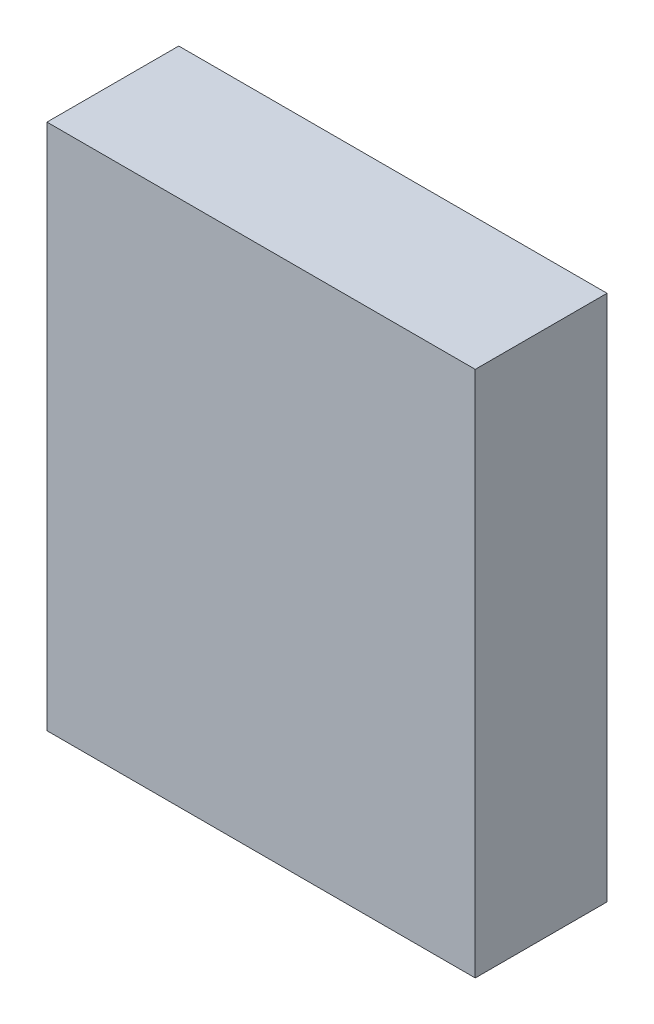
ISO-10303-21;
HEADER;
FILE_DESCRIPTION(('STEP AP214'),'2;1');
FILE_NAME('part.step','',(''),(''),'','','');
FILE_SCHEMA(('AUTOMOTIVE_DESIGN { 1 0 10303 214 1 1 1 1 }'));
ENDSEC;
DATA;
#1=APPLICATION_CONTEXT('core data for automotive mechanical design processes');
#2=APPLICATION_PROTOCOL_DEFINITION('international standard','automotive_design',2000,#1);
#3=PRODUCT_CONTEXT('',#1,'mechanical');
#4=PRODUCT('Part','Part','',(#3));
#5=PRODUCT_RELATED_PRODUCT_CATEGORY('part','',(#4));
#6=PRODUCT_DEFINITION_FORMATION('','',#4);
#7=PRODUCT_DEFINITION_CONTEXT('part definition',#1,'design');
#8=PRODUCT_DEFINITION('design','',#6,#7);
#9=PRODUCT_DEFINITION_SHAPE('','',#8);
#10=(LENGTH_UNIT() NAMED_UNIT(*) SI_UNIT(.MILLI.,.METRE.));
#11=(NAMED_UNIT(*) PLANE_ANGLE_UNIT() SI_UNIT($,.RADIAN.));
#12=(NAMED_UNIT(*) SI_UNIT($,.STERADIAN.) SOLID_ANGLE_UNIT());
#13=UNCERTAINTY_MEASURE_WITH_UNIT(LENGTH_MEASURE(1.E-05),#10,'distance_accuracy_value','');
#14=(GEOMETRIC_REPRESENTATION_CONTEXT(3) GLOBAL_UNCERTAINTY_ASSIGNED_CONTEXT((#13)) GLOBAL_UNIT_ASSIGNED_CONTEXT((#10,
#11,#12)) REPRESENTATION_CONTEXT('',''));
#15=CARTESIAN_POINT('',(0.,0.,0.));
#16=DIRECTION('',(0.,0.,1.));
#17=DIRECTION('',(1.,0.,0.));
#18=AXIS2_PLACEMENT_3D('',#15,#16,#17);
#19=CARTESIAN_POINT('',(-283.328848216629,276.320789782176,20.));
#20=DIRECTION('',(1.,0.,0.));
#21=DIRECTION('',(0.,0.,-1.));
#22=AXIS2_PLACEMENT_3D('',#19,#20,#21);
#23=PLANE('',#22);
#24=DIRECTION('',(0.,-1.,0.));
#25=VECTOR('',#24,1.);
#26=CARTESIAN_POINT('',(-283.328848216629,276.320789782176,0.));
#27=LINE('',#26,#25);
#28=CARTESIAN_POINT('',(-283.328848216629,356.320789782176,0.));
#29=VERTEX_POINT('',#28);
#30=CARTESIAN_POINT('',(-283.328848216629,276.320789782176,0.));
#31=VERTEX_POINT('',#30);
#32=EDGE_CURVE('E196',#29,#31,#27,.T.);
#33=ORIENTED_EDGE('',*,*,#32,.T.);
#34=DIRECTION('',(0.,0.,-1.));
#35=VECTOR('',#34,1.);
#36=CARTESIAN_POINT('',(-283.328848216629,276.320789782176,20.));
#37=LINE('',#36,#35);
#38=CARTESIAN_POINT('',(-283.328848216629,276.320789782176,20.));
#39=VERTEX_POINT('',#38);
#40=EDGE_CURVE('E244',#39,#31,#37,.T.);
#41=ORIENTED_EDGE('',*,*,#40,.F.);
#42=DIRECTION('',(0.,-1.,0.));
#43=VECTOR('',#42,1.);
#44=CARTESIAN_POINT('',(-283.328848216629,276.320789782176,20.));
#45=LINE('',#44,#43);
#46=CARTESIAN_POINT('',(-283.328848216629,356.320789782176,20.));
#47=VERTEX_POINT('',#46);
#48=EDGE_CURVE('E206',#47,#39,#45,.T.);
#49=ORIENTED_EDGE('',*,*,#48,.F.);
#50=DIRECTION('',(0.,0.,-1.));
#51=VECTOR('',#50,1.);
#52=CARTESIAN_POINT('',(-283.328848216629,356.320789782176,20.));
#53=LINE('',#52,#51);
#54=EDGE_CURVE('E220',#47,#29,#53,.T.);
#55=ORIENTED_EDGE('',*,*,#54,.T.);
#56=EDGE_LOOP('',(#33,#41,#49,#55));
#57=FACE_BOUND('',#56,.T.);
#58=ADVANCED_FACE('F39',(#57),#23,.F.);
#59=CARTESIAN_POINT('',(-218.328848216629,276.320789782176,20.));
#60=DIRECTION('',(0.,1.,0.));
#61=DIRECTION('',(0.,0.,1.));
#62=AXIS2_PLACEMENT_3D('',#59,#60,#61);
#63=PLANE('',#62);
#64=DIRECTION('',(1.,0.,0.));
#65=VECTOR('',#64,1.);
#66=CARTESIAN_POINT('',(-218.328848216629,276.320789782176,0.));
#67=LINE('',#66,#65);
#68=CARTESIAN_POINT('',(-260.330379364183,276.320789782176,0.));
#69=VERTEX_POINT('',#68);
#70=EDGE_CURVE('E225',#31,#69,#67,.T.);
#71=ORIENTED_EDGE('',*,*,#70,.T.);
#72=DIRECTION('',(0.,0.,-1.));
#73=VECTOR('',#72,1.);
#74=CARTESIAN_POINT('',(-260.330379364183,276.320789782176,7.6549872361529));
#75=LINE('',#74,#73);
#76=CARTESIAN_POINT('',(-260.330379364183,276.320789782176,7.6549872361529));
#77=VERTEX_POINT('',#76);
#78=EDGE_CURVE('E146',#77,#69,#75,.T.);
#79=ORIENTED_EDGE('',*,*,#78,.F.);
#80=DIRECTION('',(-1.,0.,0.));
#81=VECTOR('',#80,1.);
#82=CARTESIAN_POINT('',(-249.330379364183,276.320789782176,7.6549872361529));
#83=LINE('',#82,#81);
#84=CARTESIAN_POINT('',(-249.330379364183,276.320789782176,7.6549872361529));
#85=VERTEX_POINT('',#84);
#86=EDGE_CURVE('E130',#85,#77,#83,.T.);
#87=ORIENTED_EDGE('',*,*,#86,.F.);
#88=DIRECTION('',(0.,0.,1.));
#89=VECTOR('',#88,1.);
#90=CARTESIAN_POINT('',(-249.330379364183,276.320789782176,-0.845012763847098));
#91=LINE('',#90,#89);
#92=CARTESIAN_POINT('',(-249.330379364183,276.320789782176,0.));
#93=VERTEX_POINT('',#92);
#94=EDGE_CURVE('E139',#93,#85,#91,.T.);
#95=ORIENTED_EDGE('',*,*,#94,.F.);
#96=CARTESIAN_POINT('',(-218.328848216629,276.320789782176,0.));
#97=VERTEX_POINT('',#96);
#98=EDGE_CURVE('E224',#93,#97,#67,.T.);
#99=ORIENTED_EDGE('',*,*,#98,.T.);
#100=DIRECTION('',(0.,0.,-1.));
#101=VECTOR('',#100,1.);
#102=CARTESIAN_POINT('',(-218.328848216629,276.320789782176,20.));
#103=LINE('',#102,#101);
#104=CARTESIAN_POINT('',(-218.328848216629,276.320789782176,20.));
#105=VERTEX_POINT('',#104);
#106=EDGE_CURVE('E240',#105,#97,#103,.T.);
#107=ORIENTED_EDGE('',*,*,#106,.F.);
#108=DIRECTION('',(1.,0.,0.));
#109=VECTOR('',#108,1.);
#110=CARTESIAN_POINT('',(-218.328848216629,276.320789782176,20.));
#111=LINE('',#110,#109);
#112=EDGE_CURVE('E210',#39,#105,#111,.T.);
#113=ORIENTED_EDGE('',*,*,#112,.F.);
#114=ORIENTED_EDGE('',*,*,#40,.T.);
#115=EDGE_LOOP('',(#71,#79,#87,#95,#99,#107,#113,#114));
#116=FACE_BOUND('',#115,.T.);
#117=ADVANCED_FACE('F149',(#116),#63,.F.);
#118=CARTESIAN_POINT('',(-218.328848216629,356.320789782176,20.));
#119=DIRECTION('',(-1.,0.,0.));
#120=DIRECTION('',(0.,0.,1.));
#121=AXIS2_PLACEMENT_3D('',#118,#119,#120);
#122=PLANE('',#121);
#123=DIRECTION('',(0.,1.,0.));
#124=VECTOR('',#123,1.);
#125=CARTESIAN_POINT('',(-218.328848216629,356.320789782176,0.));
#126=LINE('',#125,#124);
#127=CARTESIAN_POINT('',(-218.328848216629,356.320789782176,0.));
#128=VERTEX_POINT('',#127);
#129=EDGE_CURVE('E228',#97,#128,#126,.T.);
#130=ORIENTED_EDGE('',*,*,#129,.T.);
#131=DIRECTION('',(0.,0.,-1.));
#132=VECTOR('',#131,1.);
#133=CARTESIAN_POINT('',(-218.328848216629,356.320789782176,20.));
#134=LINE('',#133,#132);
#135=CARTESIAN_POINT('',(-218.328848216629,356.320789782176,20.));
#136=VERTEX_POINT('',#135);
#137=EDGE_CURVE('E236',#136,#128,#134,.T.);
#138=ORIENTED_EDGE('',*,*,#137,.F.);
#139=DIRECTION('',(0.,1.,0.));
#140=VECTOR('',#139,1.);
#141=CARTESIAN_POINT('',(-218.328848216629,356.320789782176,20.));
#142=LINE('',#141,#140);
#143=EDGE_CURVE('E214',#105,#136,#142,.T.);
#144=ORIENTED_EDGE('',*,*,#143,.F.);
#145=ORIENTED_EDGE('',*,*,#106,.T.);
#146=EDGE_LOOP('',(#130,#138,#144,#145));
#147=FACE_BOUND('',#146,.T.);
#148=ADVANCED_FACE('F269',(#147),#122,.F.);
#149=CARTESIAN_POINT('',(-283.328848216629,356.320789782176,20.));
#150=DIRECTION('',(0.,-1.,0.));
#151=DIRECTION('',(0.,0.,-1.));
#152=AXIS2_PLACEMENT_3D('',#149,#150,#151);
#153=PLANE('',#152);
#154=DIRECTION('',(-1.,0.,0.));
#155=VECTOR('',#154,1.);
#156=CARTESIAN_POINT('',(-283.328848216629,356.320789782176,0.));
#157=LINE('',#156,#155);
#158=EDGE_CURVE('E211',#128,#29,#157,.T.);
#159=ORIENTED_EDGE('',*,*,#158,.T.);
#160=ORIENTED_EDGE('',*,*,#54,.F.);
#161=DIRECTION('',(-1.,0.,0.));
#162=VECTOR('',#161,1.);
#163=CARTESIAN_POINT('',(-283.328848216629,356.320789782176,20.));
#164=LINE('',#163,#162);
#165=EDGE_CURVE('E217',#136,#47,#164,.T.);
#166=ORIENTED_EDGE('',*,*,#165,.F.);
#167=ORIENTED_EDGE('',*,*,#137,.T.);
#168=EDGE_LOOP('',(#159,#160,#166,#167));
#169=FACE_BOUND('',#168,.T.);
#170=ADVANCED_FACE('F275',(#169),#153,.F.);
#171=CARTESIAN_POINT('',(0.,0.,20.));
#172=DIRECTION('',(0.,0.,-1.));
#173=DIRECTION('',(-1.,0.,0.));
#174=AXIS2_PLACEMENT_3D('',#171,#172,#173);
#175=PLANE('',#174);
#176=ORIENTED_EDGE('',*,*,#48,.T.);
#177=ORIENTED_EDGE('',*,*,#112,.T.);
#178=ORIENTED_EDGE('',*,*,#143,.T.);
#179=ORIENTED_EDGE('',*,*,#165,.T.);
#180=EDGE_LOOP('',(#176,#177,#178,#179));
#181=FACE_BOUND('',#180,.T.);
#182=ADVANCED_FACE('F281',(#181),#175,.F.);
#183=CARTESIAN_POINT('',(0.,0.,0.));
#184=DIRECTION('',(0.,0.,-1.));
#185=DIRECTION('',(-1.,0.,0.));
#186=AXIS2_PLACEMENT_3D('',#183,#184,#185);
#187=PLANE('',#186);
#188=DIRECTION('',(0.,1.,0.));
#189=VECTOR('',#188,1.);
#190=CARTESIAN_POINT('',(-260.330379364183,0.,0.));
#191=LINE('',#190,#189);
#192=CARTESIAN_POINT('',(-260.330379364183,278.761133349395,0.));
#193=VERTEX_POINT('',#192);
#194=EDGE_CURVE('E158',#69,#193,#191,.T.);
#195=ORIENTED_EDGE('',*,*,#194,.F.);
#196=ORIENTED_EDGE('',*,*,#70,.F.);
#197=ORIENTED_EDGE('',*,*,#32,.F.);
#198=ORIENTED_EDGE('',*,*,#158,.F.);
#199=ORIENTED_EDGE('',*,*,#129,.F.);
#200=ORIENTED_EDGE('',*,*,#98,.F.);
#201=DIRECTION('',(0.,-1.,0.));
#202=VECTOR('',#201,1.);
#203=CARTESIAN_POINT('',(-249.330379364183,0.,0.));
#204=LINE('',#203,#202);
#205=CARTESIAN_POINT('',(-249.330379364183,278.761133349395,0.));
#206=VERTEX_POINT('',#205);
#207=EDGE_CURVE('E142',#206,#93,#204,.T.);
#208=ORIENTED_EDGE('',*,*,#207,.F.);
#209=DIRECTION('',(-1.,0.,0.));
#210=VECTOR('',#209,1.);
#211=CARTESIAN_POINT('',(-281.285132485928,278.761133349395,0.));
#212=LINE('',#211,#210);
#213=CARTESIAN_POINT('',(-220.285132485928,278.761133349395,0.));
#214=VERTEX_POINT('',#213);
#215=EDGE_CURVE('E182',#214,#206,#212,.T.);
#216=ORIENTED_EDGE('',*,*,#215,.F.);
#217=DIRECTION('',(0.,-1.,0.));
#218=VECTOR('',#217,1.);
#219=CARTESIAN_POINT('',(-220.285132485928,278.761133349395,0.));
#220=LINE('',#219,#218);
#221=CARTESIAN_POINT('',(-220.285132485928,354.761133349395,0.));
#222=VERTEX_POINT('',#221);
#223=EDGE_CURVE('E62',#222,#214,#220,.T.);
#224=ORIENTED_EDGE('',*,*,#223,.F.);
#225=DIRECTION('',(1.,0.,0.));
#226=VECTOR('',#225,1.);
#227=CARTESIAN_POINT('',(-220.285132485928,354.761133349395,0.));
#228=LINE('',#227,#226);
#229=CARTESIAN_POINT('',(-281.285132485928,354.761133349395,0.));
#230=VERTEX_POINT('',#229);
#231=EDGE_CURVE('E166',#230,#222,#228,.T.);
#232=ORIENTED_EDGE('',*,*,#231,.F.);
#233=DIRECTION('',(0.,1.,0.));
#234=VECTOR('',#233,1.);
#235=CARTESIAN_POINT('',(-281.285132485928,354.761133349395,0.));
#236=LINE('',#235,#234);
#237=CARTESIAN_POINT('',(-281.285132485928,278.761133349395,0.));
#238=VERTEX_POINT('',#237);
#239=EDGE_CURVE('E186',#238,#230,#236,.T.);
#240=ORIENTED_EDGE('',*,*,#239,.F.);
#241=EDGE_CURVE('E181',#193,#238,#212,.T.);
#242=ORIENTED_EDGE('',*,*,#241,.F.);
#243=EDGE_LOOP('',(#195,#196,#197,#198,#199,#200,#208,#216,#224,#232,#240,#242));
#244=FACE_BOUND('',#243,.T.);
#245=ADVANCED_FACE('F261',(#244),#187,.T.);
#246=CARTESIAN_POINT('',(-220.285132485928,278.761133349395,18.));
#247=DIRECTION('',(1.,0.,0.));
#248=DIRECTION('',(0.,0.,-1.));
#249=AXIS2_PLACEMENT_3D('',#246,#247,#248);
#250=PLANE('',#249);
#251=ORIENTED_EDGE('',*,*,#223,.T.);
#252=DIRECTION('',(0.,0.,-1.));
#253=VECTOR('',#252,1.);
#254=CARTESIAN_POINT('',(-220.285132485928,278.761133349395,18.));
#255=LINE('',#254,#253);
#256=CARTESIAN_POINT('',(-220.285132485928,278.761133349395,18.));
#257=VERTEX_POINT('',#256);
#258=EDGE_CURVE('E178',#257,#214,#255,.T.);
#259=ORIENTED_EDGE('',*,*,#258,.F.);
#260=DIRECTION('',(0.,-1.,0.));
#261=VECTOR('',#260,1.);
#262=CARTESIAN_POINT('',(-220.285132485928,278.761133349395,18.));
#263=LINE('',#262,#261);
#264=CARTESIAN_POINT('',(-220.285132485928,354.761133349395,18.));
#265=VERTEX_POINT('',#264);
#266=EDGE_CURVE('E161',#265,#257,#263,.T.);
#267=ORIENTED_EDGE('',*,*,#266,.F.);
#268=DIRECTION('',(0.,0.,-1.));
#269=VECTOR('',#268,1.);
#270=CARTESIAN_POINT('',(-220.285132485928,354.761133349395,18.));
#271=LINE('',#270,#269);
#272=EDGE_CURVE('E193',#265,#222,#271,.T.);
#273=ORIENTED_EDGE('',*,*,#272,.T.);
#274=EDGE_LOOP('',(#251,#259,#267,#273));
#275=FACE_BOUND('',#274,.T.);
#276=ADVANCED_FACE('F288',(#275),#250,.F.);
#277=CARTESIAN_POINT('',(-220.285132485928,354.761133349395,18.));
#278=DIRECTION('',(0.,1.,0.));
#279=DIRECTION('',(0.,0.,1.));
#280=AXIS2_PLACEMENT_3D('',#277,#278,#279);
#281=PLANE('',#280);
#282=ORIENTED_EDGE('',*,*,#231,.T.);
#283=ORIENTED_EDGE('',*,*,#272,.F.);
#284=DIRECTION('',(1.,0.,0.));
#285=VECTOR('',#284,1.);
#286=CARTESIAN_POINT('',(-220.285132485928,354.761133349395,18.));
#287=LINE('',#286,#285);
#288=CARTESIAN_POINT('',(-281.285132485928,354.761133349395,18.));
#289=VERTEX_POINT('',#288);
#290=EDGE_CURVE('E174',#289,#265,#287,.T.);
#291=ORIENTED_EDGE('',*,*,#290,.F.);
#292=DIRECTION('',(0.,0.,-1.));
#293=VECTOR('',#292,1.);
#294=CARTESIAN_POINT('',(-281.285132485928,354.761133349395,18.));
#295=LINE('',#294,#293);
#296=EDGE_CURVE('E197',#289,#230,#295,.T.);
#297=ORIENTED_EDGE('',*,*,#296,.T.);
#298=EDGE_LOOP('',(#282,#283,#291,#297));
#299=FACE_BOUND('',#298,.T.);
#300=ADVANCED_FACE('F320',(#299),#281,.F.);
#301=CARTESIAN_POINT('',(-281.285132485928,354.761133349395,18.));
#302=DIRECTION('',(-1.,0.,0.));
#303=DIRECTION('',(0.,0.,1.));
#304=AXIS2_PLACEMENT_3D('',#301,#302,#303);
#305=PLANE('',#304);
#306=ORIENTED_EDGE('',*,*,#239,.T.);
#307=ORIENTED_EDGE('',*,*,#296,.F.);
#308=DIRECTION('',(0.,1.,0.));
#309=VECTOR('',#308,1.);
#310=CARTESIAN_POINT('',(-281.285132485928,354.761133349395,18.));
#311=LINE('',#310,#309);
#312=CARTESIAN_POINT('',(-281.285132485928,278.761133349395,18.));
#313=VERTEX_POINT('',#312);
#314=EDGE_CURVE('E170',#313,#289,#311,.T.);
#315=ORIENTED_EDGE('',*,*,#314,.F.);
#316=DIRECTION('',(0.,0.,-1.));
#317=VECTOR('',#316,1.);
#318=CARTESIAN_POINT('',(-281.285132485928,278.761133349395,18.));
#319=LINE('',#318,#317);
#320=EDGE_CURVE('E200',#313,#238,#319,.T.);
#321=ORIENTED_EDGE('',*,*,#320,.T.);
#322=EDGE_LOOP('',(#306,#307,#315,#321));
#323=FACE_BOUND('',#322,.T.);
#324=ADVANCED_FACE('F328',(#323),#305,.F.);
#325=CARTESIAN_POINT('',(-281.285132485928,278.761133349395,18.));
#326=DIRECTION('',(0.,-1.,0.));
#327=DIRECTION('',(0.,0.,-1.));
#328=AXIS2_PLACEMENT_3D('',#325,#326,#327);
#329=PLANE('',#328);
#330=DIRECTION('',(-1.,0.,0.));
#331=VECTOR('',#330,1.);
#332=CARTESIAN_POINT('',(-281.285132485928,278.761133349395,7.6549872361529));
#333=LINE('',#332,#331);
#334=CARTESIAN_POINT('',(-249.330379364183,278.761133349395,7.6549872361529));
#335=VERTEX_POINT('',#334);
#336=CARTESIAN_POINT('',(-260.330379364183,278.761133349395,7.6549872361529));
#337=VERTEX_POINT('',#336);
#338=EDGE_CURVE('E133',#335,#337,#333,.T.);
#339=ORIENTED_EDGE('',*,*,#338,.T.);
#340=DIRECTION('',(0.,0.,-1.));
#341=VECTOR('',#340,1.);
#342=CARTESIAN_POINT('',(-260.330379364183,278.761133349395,18.));
#343=LINE('',#342,#341);
#344=EDGE_CURVE('E47',#337,#193,#343,.T.);
#345=ORIENTED_EDGE('',*,*,#344,.T.);
#346=ORIENTED_EDGE('',*,*,#241,.T.);
#347=ORIENTED_EDGE('',*,*,#320,.F.);
#348=DIRECTION('',(-1.,0.,0.));
#349=VECTOR('',#348,1.);
#350=CARTESIAN_POINT('',(-281.285132485928,278.761133349395,18.));
#351=LINE('',#350,#349);
#352=EDGE_CURVE('E165',#257,#313,#351,.T.);
#353=ORIENTED_EDGE('',*,*,#352,.F.);
#354=ORIENTED_EDGE('',*,*,#258,.T.);
#355=ORIENTED_EDGE('',*,*,#215,.T.);
#356=DIRECTION('',(0.,0.,1.));
#357=VECTOR('',#356,1.);
#358=CARTESIAN_POINT('',(-249.330379364183,278.761133349395,18.));
#359=LINE('',#358,#357);
#360=EDGE_CURVE('E248',#206,#335,#359,.T.);
#361=ORIENTED_EDGE('',*,*,#360,.T.);
#362=EDGE_LOOP('',(#339,#345,#346,#347,#353,#354,#355,#361));
#363=FACE_BOUND('',#362,.T.);
#364=ADVANCED_FACE('F256',(#363),#329,.F.);
#365=CARTESIAN_POINT('',(0.,0.,18.));
#366=DIRECTION('',(0.,0.,1.));
#367=DIRECTION('',(1.,0.,0.));
#368=AXIS2_PLACEMENT_3D('',#365,#366,#367);
#369=PLANE('',#368);
#370=CARTESIAN_POINT('',(-251.224275907484,345.746509498901,18.));
#371=DIRECTION('',(0.,0.,1.));
#372=DIRECTION('',(1.,0.,0.));
#373=AXIS2_PLACEMENT_3D('',#370,#371,#372);
#374=CIRCLE('',#373,5.18275391906846);
#375=CARTESIAN_POINT('',(-246.041521988416,345.746509498901,18.));
#376=VERTEX_POINT('',#375);
#377=EDGE_CURVE('E11',#376,#376,#374,.F.);
#378=ORIENTED_EDGE('',*,*,#377,.F.);
#379=EDGE_LOOP('',(#378));
#380=FACE_BOUND('',#379,.T.);
#381=ORIENTED_EDGE('',*,*,#266,.T.);
#382=ORIENTED_EDGE('',*,*,#352,.T.);
#383=ORIENTED_EDGE('',*,*,#314,.T.);
#384=ORIENTED_EDGE('',*,*,#290,.T.);
#385=EDGE_LOOP('',(#381,#382,#383,#384));
#386=FACE_BOUND('',#385,.T.);
#387=ADVANCED_FACE('F357',(#380,#386),#369,.F.);
#388=CARTESIAN_POINT('',(-249.330379364183,279.320789782176,7.6549872361529));
#389=DIRECTION('',(0.,0.,1.));
#390=DIRECTION('',(1.,0.,0.));
#391=AXIS2_PLACEMENT_3D('',#388,#389,#390);
#392=PLANE('',#391);
#393=DIRECTION('',(0.,-1.,0.));
#394=VECTOR('',#393,1.);
#395=CARTESIAN_POINT('',(-249.330379364183,279.320789782176,7.6549872361529));
#396=LINE('',#395,#394);
#397=EDGE_CURVE('E54',#335,#85,#396,.T.);
#398=ORIENTED_EDGE('',*,*,#397,.T.);
#399=ORIENTED_EDGE('',*,*,#86,.T.);
#400=DIRECTION('',(0.,-1.,0.));
#401=VECTOR('',#400,1.);
#402=CARTESIAN_POINT('',(-260.330379364183,279.320789782176,7.6549872361529));
#403=LINE('',#402,#401);
#404=EDGE_CURVE('E136',#337,#77,#403,.T.);
#405=ORIENTED_EDGE('',*,*,#404,.F.);
#406=ORIENTED_EDGE('',*,*,#338,.F.);
#407=EDGE_LOOP('',(#398,#399,#405,#406));
#408=FACE_BOUND('',#407,.T.);
#409=ADVANCED_FACE('F127',(#408),#392,.F.);
#410=CARTESIAN_POINT('',(-260.330379364183,279.320789782176,7.6549872361529));
#411=DIRECTION('',(-1.,0.,0.));
#412=DIRECTION('',(0.,0.,1.));
#413=AXIS2_PLACEMENT_3D('',#410,#411,#412);
#414=PLANE('',#413);
#415=ORIENTED_EDGE('',*,*,#194,.T.);
#416=ORIENTED_EDGE('',*,*,#344,.F.);
#417=ORIENTED_EDGE('',*,*,#404,.T.);
#418=ORIENTED_EDGE('',*,*,#78,.T.);
#419=EDGE_LOOP('',(#415,#416,#417,#418));
#420=FACE_BOUND('',#419,.T.);
#421=ADVANCED_FACE('F368',(#420),#414,.F.);
#422=CARTESIAN_POINT('',(-249.330379364183,279.320789782176,-0.845012763847098));
#423=DIRECTION('',(1.,0.,0.));
#424=DIRECTION('',(0.,0.,-1.));
#425=AXIS2_PLACEMENT_3D('',#422,#423,#424);
#426=PLANE('',#425);
#427=ORIENTED_EDGE('',*,*,#207,.T.);
#428=ORIENTED_EDGE('',*,*,#94,.T.);
#429=ORIENTED_EDGE('',*,*,#397,.F.);
#430=ORIENTED_EDGE('',*,*,#360,.F.);
#431=EDGE_LOOP('',(#427,#428,#429,#430));
#432=FACE_BOUND('',#431,.T.);
#433=ADVANCED_FACE('F140',(#432),#426,.F.);
#434=CARTESIAN_POINT('',(-251.224275907484,345.746509498901,0.999999999999997));
#435=DIRECTION('',(0.,0.,1.));
#436=DIRECTION('',(1.,0.,0.));
#437=AXIS2_PLACEMENT_3D('',#434,#435,#436);
#438=CYLINDRICAL_SURFACE('',#437,5.18275391906846);
#439=CARTESIAN_POINT('',(-251.224275907484,345.746509498901,0.999999999999997));
#440=DIRECTION('',(0.,0.,-1.));
#441=DIRECTION('',(-1.,0.,0.));
#442=AXIS2_PLACEMENT_3D('',#439,#440,#441);
#443=CIRCLE('',#442,5.18275391906846);
#444=CARTESIAN_POINT('',(-256.407029826553,345.746509498901,0.999999999999997));
#445=VERTEX_POINT('',#444);
#446=EDGE_CURVE('E417',#445,#445,#443,.T.);
#447=ORIENTED_EDGE('',*,*,#446,.F.);
#448=EDGE_LOOP('',(#447));
#449=FACE_BOUND('',#448,.T.);
#450=ORIENTED_EDGE('',*,*,#377,.T.);
#451=EDGE_LOOP('',(#450));
#452=FACE_BOUND('',#451,.T.);
#453=ADVANCED_FACE('F385',(#449,#452),#438,.T.);
#454=CARTESIAN_POINT('',(-251.224275907484,345.746509498901,0.999999999999997));
#455=DIRECTION('',(0.,0.,-1.));
#456=DIRECTION('',(-1.,0.,0.));
#457=AXIS2_PLACEMENT_3D('',#454,#455,#456);
#458=PLANE('',#457);
#459=ORIENTED_EDGE('',*,*,#446,.T.);
#460=EDGE_LOOP('',(#459));
#461=FACE_BOUND('',#460,.T.);
#462=ADVANCED_FACE('F401',(#461),#458,.T.);
#463=CLOSED_SHELL('',(#58,#117,#148,#170,#182,#245,#276,#300,#324,#364,#387,#409,#421,#433,#453,#462));
#464=MANIFOLD_SOLID_BREP('B2',#463);
#465=ADVANCED_BREP_SHAPE_REPRESENTATION('',(#18,#464),#14);
#466=SHAPE_DEFINITION_REPRESENTATION(#9,#465);
ENDSEC;
END-ISO-10303-21;
